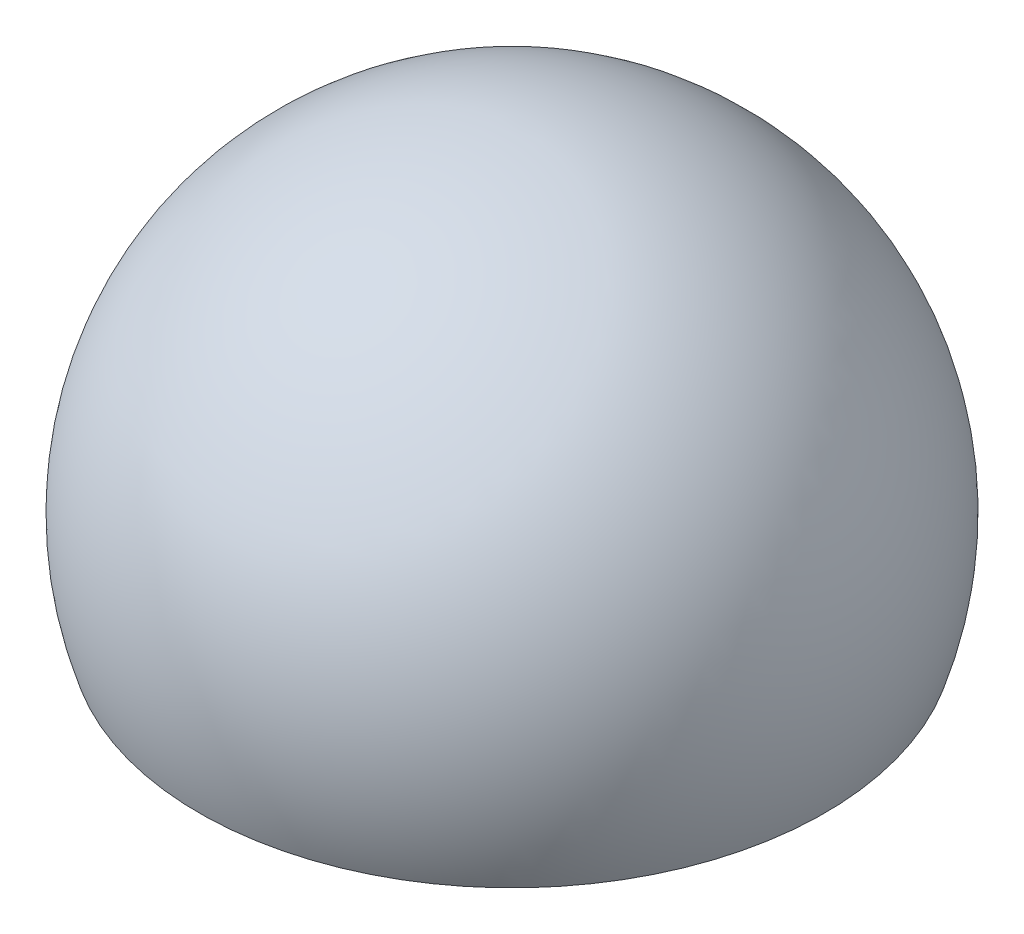
ISO-10303-21;
HEADER;
FILE_DESCRIPTION(('STEP AP214'),'2;1');
FILE_NAME('part.step','',(''),(''),'','','');
FILE_SCHEMA(('AUTOMOTIVE_DESIGN { 1 0 10303 214 1 1 1 1 }'));
ENDSEC;
DATA;
#1=APPLICATION_CONTEXT('core data for automotive mechanical design processes');
#2=APPLICATION_PROTOCOL_DEFINITION('international standard','automotive_design',2000,#1);
#3=PRODUCT_CONTEXT('',#1,'mechanical');
#4=PRODUCT('Part','Part','',(#3));
#5=PRODUCT_RELATED_PRODUCT_CATEGORY('part','',(#4));
#6=PRODUCT_DEFINITION_FORMATION('','',#4);
#7=PRODUCT_DEFINITION_CONTEXT('part definition',#1,'design');
#8=PRODUCT_DEFINITION('design','',#6,#7);
#9=PRODUCT_DEFINITION_SHAPE('','',#8);
#10=(LENGTH_UNIT() NAMED_UNIT(*) SI_UNIT(.MILLI.,.METRE.));
#11=(NAMED_UNIT(*) PLANE_ANGLE_UNIT() SI_UNIT($,.RADIAN.));
#12=(NAMED_UNIT(*) SI_UNIT($,.STERADIAN.) SOLID_ANGLE_UNIT());
#13=UNCERTAINTY_MEASURE_WITH_UNIT(LENGTH_MEASURE(1.E-05),#10,'distance_accuracy_value','');
#14=(GEOMETRIC_REPRESENTATION_CONTEXT(3) GLOBAL_UNCERTAINTY_ASSIGNED_CONTEXT((#13)) GLOBAL_UNIT_ASSIGNED_CONTEXT((#10,
#11,#12)) REPRESENTATION_CONTEXT('',''));
#15=CARTESIAN_POINT('',(0.,0.,0.));
#16=DIRECTION('',(0.,0.,1.));
#17=DIRECTION('',(1.,0.,0.));
#18=AXIS2_PLACEMENT_3D('',#15,#16,#17);
#19=CARTESIAN_POINT('',(0.,5.,0.));
#20=DIRECTION('',(0.,-1.,0.));
#21=DIRECTION('',(0.,0.,-1.));
#22=AXIS2_PLACEMENT_3D('',#19,#20,#21);
#23=PLANE('',#22);
#24=CARTESIAN_POINT('',(0.,5.,0.));
#25=DIRECTION('',(0.,-1.,0.));
#26=DIRECTION('',(0.,0.,-1.));
#27=AXIS2_PLACEMENT_3D('',#24,#25,#26);
#28=CIRCLE('',#27,23.7226775912578);
#29=CARTESIAN_POINT('',(0.,5.,-23.7226775912578));
#30=VERTEX_POINT('',#29);
#31=EDGE_CURVE('E93',#30,#30,#28,.F.);
#32=ORIENTED_EDGE('',*,*,#31,.F.);
#33=EDGE_LOOP('',(#32));
#34=FACE_BOUND('',#33,.T.);
#35=DIRECTION('',(1.,0.,0.));
#36=VECTOR('',#35,1.);
#37=CARTESIAN_POINT('',(0.,5.,5.));
#38=LINE('',#37,#36);
#39=CARTESIAN_POINT('',(-2.5,5.,5.));
#40=VERTEX_POINT('',#39);
#41=CARTESIAN_POINT('',(2.5,5.,5.));
#42=VERTEX_POINT('',#41);
#43=EDGE_CURVE('E97',#40,#42,#38,.T.);
#44=ORIENTED_EDGE('',*,*,#43,.T.);
#45=DIRECTION('',(0.,0.,-1.));
#46=VECTOR('',#45,1.);
#47=CARTESIAN_POINT('',(2.5,5.,0.));
#48=LINE('',#47,#46);
#49=CARTESIAN_POINT('',(2.5,5.,-5.));
#50=VERTEX_POINT('',#49);
#51=EDGE_CURVE('E11',#42,#50,#48,.T.);
#52=ORIENTED_EDGE('',*,*,#51,.T.);
#53=DIRECTION('',(-1.,0.,0.));
#54=VECTOR('',#53,1.);
#55=CARTESIAN_POINT('',(0.,5.,-5.));
#56=LINE('',#55,#54);
#57=CARTESIAN_POINT('',(-2.5,5.,-5.));
#58=VERTEX_POINT('',#57);
#59=EDGE_CURVE('E46',#50,#58,#56,.T.);
#60=ORIENTED_EDGE('',*,*,#59,.T.);
#61=DIRECTION('',(0.,0.,1.));
#62=VECTOR('',#61,1.);
#63=CARTESIAN_POINT('',(-2.5,5.,0.));
#64=LINE('',#63,#62);
#65=EDGE_CURVE('E105',#58,#40,#64,.T.);
#66=ORIENTED_EDGE('',*,*,#65,.T.);
#67=EDGE_LOOP('',(#44,#52,#60,#66));
#68=FACE_BOUND('',#67,.T.);
#69=ADVANCED_FACE('F38',(#34,#68),#23,.T.);
#70=CARTESIAN_POINT('',(0.,12.8888888888889,0.));
#71=DIRECTION('',(0.,1.,0.));
#72=DIRECTION('',(-1.,0.,0.));
#73=AXIS2_PLACEMENT_3D('',#70,#71,#72);
#74=SPHERICAL_SURFACE('',#73,25.);
#75=ORIENTED_EDGE('',*,*,#31,.T.);
#76=EDGE_LOOP('',(#75));
#77=FACE_BOUND('',#76,.T.);
#78=ADVANCED_FACE('F40',(#77),#74,.T.);
#79=CARTESIAN_POINT('',(2.5,10.,5.));
#80=DIRECTION('',(-1.,0.,0.));
#81=DIRECTION('',(0.,0.,1.));
#82=AXIS2_PLACEMENT_3D('',#79,#80,#81);
#83=PLANE('',#82);
#84=DIRECTION('',(0.,-1.,0.));
#85=VECTOR('',#84,1.);
#86=CARTESIAN_POINT('',(2.5,10.,5.));
#87=LINE('',#86,#85);
#88=CARTESIAN_POINT('',(2.5,10.,5.));
#89=VERTEX_POINT('',#88);
#90=EDGE_CURVE('E53',#89,#42,#87,.T.);
#91=ORIENTED_EDGE('',*,*,#90,.F.);
#92=DIRECTION('',(0.,0.,-1.));
#93=VECTOR('',#92,1.);
#94=CARTESIAN_POINT('',(2.5,10.,5.));
#95=LINE('',#94,#93);
#96=CARTESIAN_POINT('',(2.5,10.,-5.));
#97=VERTEX_POINT('',#96);
#98=EDGE_CURVE('E84',#89,#97,#95,.T.);
#99=ORIENTED_EDGE('',*,*,#98,.T.);
#100=DIRECTION('',(0.,-1.,0.));
#101=VECTOR('',#100,1.);
#102=CARTESIAN_POINT('',(2.5,10.,-5.));
#103=LINE('',#102,#101);
#104=EDGE_CURVE('E90',#97,#50,#103,.T.);
#105=ORIENTED_EDGE('',*,*,#104,.T.);
#106=ORIENTED_EDGE('',*,*,#51,.F.);
#107=EDGE_LOOP('',(#91,#99,#105,#106));
#108=FACE_BOUND('',#107,.T.);
#109=ADVANCED_FACE('F89',(#108),#83,.T.);
#110=CARTESIAN_POINT('',(-2.5,10.,-5.));
#111=DIRECTION('',(0.,0.,1.));
#112=DIRECTION('',(1.,0.,0.));
#113=AXIS2_PLACEMENT_3D('',#110,#111,#112);
#114=PLANE('',#113);
#115=ORIENTED_EDGE('',*,*,#104,.F.);
#116=DIRECTION('',(-1.,0.,0.));
#117=VECTOR('',#116,1.);
#118=CARTESIAN_POINT('',(-2.5,10.,-5.));
#119=LINE('',#118,#117);
#120=CARTESIAN_POINT('',(-2.5,10.,-5.));
#121=VERTEX_POINT('',#120);
#122=EDGE_CURVE('E80',#97,#121,#119,.T.);
#123=ORIENTED_EDGE('',*,*,#122,.T.);
#124=DIRECTION('',(0.,-1.,0.));
#125=VECTOR('',#124,1.);
#126=CARTESIAN_POINT('',(-2.5,10.,-5.));
#127=LINE('',#126,#125);
#128=EDGE_CURVE('E94',#121,#58,#127,.T.);
#129=ORIENTED_EDGE('',*,*,#128,.T.);
#130=ORIENTED_EDGE('',*,*,#59,.F.);
#131=EDGE_LOOP('',(#115,#123,#129,#130));
#132=FACE_BOUND('',#131,.T.);
#133=ADVANCED_FACE('F92',(#132),#114,.T.);
#134=CARTESIAN_POINT('',(-2.5,10.,5.));
#135=DIRECTION('',(1.,0.,0.));
#136=DIRECTION('',(0.,0.,-1.));
#137=AXIS2_PLACEMENT_3D('',#134,#135,#136);
#138=PLANE('',#137);
#139=ORIENTED_EDGE('',*,*,#128,.F.);
#140=DIRECTION('',(0.,0.,1.));
#141=VECTOR('',#140,1.);
#142=CARTESIAN_POINT('',(-2.5,10.,5.));
#143=LINE('',#142,#141);
#144=CARTESIAN_POINT('',(-2.5,10.,5.));
#145=VERTEX_POINT('',#144);
#146=EDGE_CURVE('E85',#121,#145,#143,.T.);
#147=ORIENTED_EDGE('',*,*,#146,.T.);
#148=DIRECTION('',(0.,-1.,0.));
#149=VECTOR('',#148,1.);
#150=CARTESIAN_POINT('',(-2.5,10.,5.));
#151=LINE('',#150,#149);
#152=EDGE_CURVE('E99',#145,#40,#151,.T.);
#153=ORIENTED_EDGE('',*,*,#152,.T.);
#154=ORIENTED_EDGE('',*,*,#65,.F.);
#155=EDGE_LOOP('',(#139,#147,#153,#154));
#156=FACE_BOUND('',#155,.T.);
#157=ADVANCED_FACE('F112',(#156),#138,.T.);
#158=CARTESIAN_POINT('',(-2.5,10.,5.));
#159=DIRECTION('',(0.,0.,-1.));
#160=DIRECTION('',(-1.,0.,0.));
#161=AXIS2_PLACEMENT_3D('',#158,#159,#160);
#162=PLANE('',#161);
#163=ORIENTED_EDGE('',*,*,#152,.F.);
#164=DIRECTION('',(1.,0.,0.));
#165=VECTOR('',#164,1.);
#166=CARTESIAN_POINT('',(-2.5,10.,5.));
#167=LINE('',#166,#165);
#168=EDGE_CURVE('E113',#145,#89,#167,.T.);
#169=ORIENTED_EDGE('',*,*,#168,.T.);
#170=ORIENTED_EDGE('',*,*,#90,.T.);
#171=ORIENTED_EDGE('',*,*,#43,.F.);
#172=EDGE_LOOP('',(#163,#169,#170,#171));
#173=FACE_BOUND('',#172,.T.);
#174=ADVANCED_FACE('F110',(#173),#162,.T.);
#175=CARTESIAN_POINT('',(0.,10.,0.));
#176=DIRECTION('',(0.,-1.,0.));
#177=DIRECTION('',(0.,0.,-1.));
#178=AXIS2_PLACEMENT_3D('',#175,#176,#177);
#179=PLANE('',#178);
#180=ORIENTED_EDGE('',*,*,#98,.F.);
#181=ORIENTED_EDGE('',*,*,#168,.F.);
#182=ORIENTED_EDGE('',*,*,#146,.F.);
#183=ORIENTED_EDGE('',*,*,#122,.F.);
#184=EDGE_LOOP('',(#180,#181,#182,#183));
#185=FACE_BOUND('',#184,.T.);
#186=ADVANCED_FACE('F82',(#185),#179,.T.);
#187=CLOSED_SHELL('',(#69,#78,#109,#133,#157,#174,#186));
#188=MANIFOLD_SOLID_BREP('B2',#187);
#189=ADVANCED_BREP_SHAPE_REPRESENTATION('',(#18,#188),#14);
#190=SHAPE_DEFINITION_REPRESENTATION(#9,#189);
ENDSEC;
END-ISO-10303-21;
